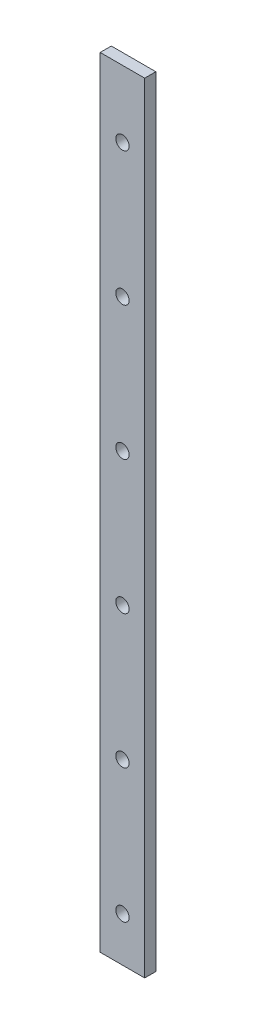
ISO-10303-21;
HEADER;
FILE_DESCRIPTION(('STEP AP214'),'2;1');
FILE_NAME('part.step','',(''),(''),'','','');
FILE_SCHEMA(('AUTOMOTIVE_DESIGN { 1 0 10303 214 1 1 1 1 }'));
ENDSEC;
DATA;
#1=APPLICATION_CONTEXT('core data for automotive mechanical design processes');
#2=APPLICATION_PROTOCOL_DEFINITION('international standard','automotive_design',2000,#1);
#3=PRODUCT_CONTEXT('',#1,'mechanical');
#4=PRODUCT('Part','Part','',(#3));
#5=PRODUCT_RELATED_PRODUCT_CATEGORY('part','',(#4));
#6=PRODUCT_DEFINITION_FORMATION('','',#4);
#7=PRODUCT_DEFINITION_CONTEXT('part definition',#1,'design');
#8=PRODUCT_DEFINITION('design','',#6,#7);
#9=PRODUCT_DEFINITION_SHAPE('','',#8);
#10=(LENGTH_UNIT() NAMED_UNIT(*) SI_UNIT(.MILLI.,.METRE.));
#11=(NAMED_UNIT(*) PLANE_ANGLE_UNIT() SI_UNIT($,.RADIAN.));
#12=(NAMED_UNIT(*) SI_UNIT($,.STERADIAN.) SOLID_ANGLE_UNIT());
#13=UNCERTAINTY_MEASURE_WITH_UNIT(LENGTH_MEASURE(1.E-05),#10,'distance_accuracy_value','');
#14=(GEOMETRIC_REPRESENTATION_CONTEXT(3) GLOBAL_UNCERTAINTY_ASSIGNED_CONTEXT((#13)) GLOBAL_UNIT_ASSIGNED_CONTEXT((#10,
#11,#12)) REPRESENTATION_CONTEXT('',''));
#15=CARTESIAN_POINT('',(0.,0.,0.));
#16=DIRECTION('',(0.,0.,1.));
#17=DIRECTION('',(1.,0.,0.));
#18=AXIS2_PLACEMENT_3D('',#15,#16,#17);
#19=CARTESIAN_POINT('',(0.,320.,-5.));
#20=DIRECTION('',(0.,0.,1.));
#21=DIRECTION('',(1.,0.,0.));
#22=AXIS2_PLACEMENT_3D('',#19,#20,#21);
#23=CYLINDRICAL_SURFACE('',#22,3.);
#24=CARTESIAN_POINT('',(0.,320.,0.));
#25=DIRECTION('',(0.,0.,-1.));
#26=DIRECTION('',(-1.,0.,0.));
#27=AXIS2_PLACEMENT_3D('',#24,#25,#26);
#28=CIRCLE('',#27,3.);
#29=CARTESIAN_POINT('',(-3.,320.,0.));
#30=VERTEX_POINT('',#29);
#31=EDGE_CURVE('E41',#30,#30,#28,.T.);
#32=ORIENTED_EDGE('',*,*,#31,.T.);
#33=EDGE_LOOP('',(#32));
#34=FACE_BOUND('',#33,.T.);
#35=CARTESIAN_POINT('',(0.,320.,5.));
#36=DIRECTION('',(0.,0.,1.));
#37=DIRECTION('',(1.,0.,0.));
#38=AXIS2_PLACEMENT_3D('',#35,#36,#37);
#39=CIRCLE('',#38,3.);
#40=CARTESIAN_POINT('',(3.,320.,5.));
#41=VERTEX_POINT('',#40);
#42=EDGE_CURVE('E11',#41,#41,#39,.T.);
#43=ORIENTED_EDGE('',*,*,#42,.T.);
#44=EDGE_LOOP('',(#43));
#45=FACE_BOUND('',#44,.T.);
#46=ADVANCED_FACE('F33',(#34,#45),#23,.F.);
#47=CARTESIAN_POINT('',(0.,260.,-5.));
#48=DIRECTION('',(0.,0.,1.));
#49=DIRECTION('',(1.,0.,0.));
#50=AXIS2_PLACEMENT_3D('',#47,#48,#49);
#51=CYLINDRICAL_SURFACE('',#50,3.);
#52=CARTESIAN_POINT('',(0.,260.,0.));
#53=DIRECTION('',(0.,0.,-1.));
#54=DIRECTION('',(-1.,0.,0.));
#55=AXIS2_PLACEMENT_3D('',#52,#53,#54);
#56=CIRCLE('',#55,3.);
#57=CARTESIAN_POINT('',(-3.,260.,0.));
#58=VERTEX_POINT('',#57);
#59=EDGE_CURVE('E126',#58,#58,#56,.T.);
#60=ORIENTED_EDGE('',*,*,#59,.T.);
#61=EDGE_LOOP('',(#60));
#62=FACE_BOUND('',#61,.T.);
#63=CARTESIAN_POINT('',(0.,260.,5.));
#64=DIRECTION('',(0.,0.,1.));
#65=DIRECTION('',(1.,0.,0.));
#66=AXIS2_PLACEMENT_3D('',#63,#64,#65);
#67=CIRCLE('',#66,3.);
#68=CARTESIAN_POINT('',(3.,260.,5.));
#69=VERTEX_POINT('',#68);
#70=EDGE_CURVE('E129',#69,#69,#67,.T.);
#71=ORIENTED_EDGE('',*,*,#70,.T.);
#72=EDGE_LOOP('',(#71));
#73=FACE_BOUND('',#72,.T.);
#74=ADVANCED_FACE('F155',(#62,#73),#51,.F.);
#75=CARTESIAN_POINT('',(0.,200.,-5.));
#76=DIRECTION('',(0.,0.,1.));
#77=DIRECTION('',(1.,0.,0.));
#78=AXIS2_PLACEMENT_3D('',#75,#76,#77);
#79=CYLINDRICAL_SURFACE('',#78,3.);
#80=CARTESIAN_POINT('',(0.,200.,0.));
#81=DIRECTION('',(0.,0.,-1.));
#82=DIRECTION('',(-1.,0.,0.));
#83=AXIS2_PLACEMENT_3D('',#80,#81,#82);
#84=CIRCLE('',#83,3.);
#85=CARTESIAN_POINT('',(-3.,200.,0.));
#86=VERTEX_POINT('',#85);
#87=EDGE_CURVE('E120',#86,#86,#84,.T.);
#88=ORIENTED_EDGE('',*,*,#87,.T.);
#89=EDGE_LOOP('',(#88));
#90=FACE_BOUND('',#89,.T.);
#91=CARTESIAN_POINT('',(0.,200.,5.));
#92=DIRECTION('',(0.,0.,1.));
#93=DIRECTION('',(1.,0.,0.));
#94=AXIS2_PLACEMENT_3D('',#91,#92,#93);
#95=CIRCLE('',#94,3.);
#96=CARTESIAN_POINT('',(3.,200.,5.));
#97=VERTEX_POINT('',#96);
#98=EDGE_CURVE('E123',#97,#97,#95,.T.);
#99=ORIENTED_EDGE('',*,*,#98,.T.);
#100=EDGE_LOOP('',(#99));
#101=FACE_BOUND('',#100,.T.);
#102=ADVANCED_FACE('F159',(#90,#101),#79,.F.);
#103=CARTESIAN_POINT('',(0.,140.,-5.));
#104=DIRECTION('',(0.,0.,1.));
#105=DIRECTION('',(1.,0.,0.));
#106=AXIS2_PLACEMENT_3D('',#103,#104,#105);
#107=CYLINDRICAL_SURFACE('',#106,3.);
#108=CARTESIAN_POINT('',(0.,140.,0.));
#109=DIRECTION('',(0.,0.,-1.));
#110=DIRECTION('',(-1.,0.,0.));
#111=AXIS2_PLACEMENT_3D('',#108,#109,#110);
#112=CIRCLE('',#111,3.);
#113=CARTESIAN_POINT('',(-3.,140.,0.));
#114=VERTEX_POINT('',#113);
#115=EDGE_CURVE('E111',#114,#114,#112,.T.);
#116=ORIENTED_EDGE('',*,*,#115,.T.);
#117=EDGE_LOOP('',(#116));
#118=FACE_BOUND('',#117,.T.);
#119=CARTESIAN_POINT('',(0.,140.,5.));
#120=DIRECTION('',(0.,0.,1.));
#121=DIRECTION('',(1.,0.,0.));
#122=AXIS2_PLACEMENT_3D('',#119,#120,#121);
#123=CIRCLE('',#122,3.);
#124=CARTESIAN_POINT('',(3.,140.,5.));
#125=VERTEX_POINT('',#124);
#126=EDGE_CURVE('E117',#125,#125,#123,.T.);
#127=ORIENTED_EDGE('',*,*,#126,.T.);
#128=EDGE_LOOP('',(#127));
#129=FACE_BOUND('',#128,.T.);
#130=ADVANCED_FACE('F164',(#118,#129),#107,.F.);
#131=CARTESIAN_POINT('',(-10.,0.,5.));
#132=DIRECTION('',(1.,0.,0.));
#133=DIRECTION('',(0.,0.,-1.));
#134=AXIS2_PLACEMENT_3D('',#131,#132,#133);
#135=PLANE('',#134);
#136=DIRECTION('',(0.,-1.,0.));
#137=VECTOR('',#136,1.);
#138=CARTESIAN_POINT('',(-10.,0.,0.));
#139=LINE('',#138,#137);
#140=CARTESIAN_POINT('',(-10.,350.,0.));
#141=VERTEX_POINT('',#140);
#142=CARTESIAN_POINT('',(-10.,0.,0.));
#143=VERTEX_POINT('',#142);
#144=EDGE_CURVE('E101',#141,#143,#139,.T.);
#145=ORIENTED_EDGE('',*,*,#144,.T.);
#146=DIRECTION('',(0.,0.,-1.));
#147=VECTOR('',#146,1.);
#148=CARTESIAN_POINT('',(-10.,0.,5.));
#149=LINE('',#148,#147);
#150=CARTESIAN_POINT('',(-10.,0.,5.));
#151=VERTEX_POINT('',#150);
#152=EDGE_CURVE('E92',#151,#143,#149,.T.);
#153=ORIENTED_EDGE('',*,*,#152,.F.);
#154=DIRECTION('',(0.,-1.,0.));
#155=VECTOR('',#154,1.);
#156=CARTESIAN_POINT('',(-10.,0.,5.));
#157=LINE('',#156,#155);
#158=CARTESIAN_POINT('',(-10.,350.,5.));
#159=VERTEX_POINT('',#158);
#160=EDGE_CURVE('E86',#159,#151,#157,.T.);
#161=ORIENTED_EDGE('',*,*,#160,.F.);
#162=DIRECTION('',(0.,0.,-1.));
#163=VECTOR('',#162,1.);
#164=CARTESIAN_POINT('',(-10.,350.,5.));
#165=LINE('',#164,#163);
#166=EDGE_CURVE('E97',#159,#141,#165,.T.);
#167=ORIENTED_EDGE('',*,*,#166,.T.);
#168=EDGE_LOOP('',(#145,#153,#161,#167));
#169=FACE_BOUND('',#168,.T.);
#170=ADVANCED_FACE('F171',(#169),#135,.F.);
#171=CARTESIAN_POINT('',(-10.,0.,5.));
#172=DIRECTION('',(0.,1.,0.));
#173=DIRECTION('',(0.,0.,1.));
#174=AXIS2_PLACEMENT_3D('',#171,#172,#173);
#175=PLANE('',#174);
#176=DIRECTION('',(1.,0.,0.));
#177=VECTOR('',#176,1.);
#178=CARTESIAN_POINT('',(-10.,0.,0.));
#179=LINE('',#178,#177);
#180=CARTESIAN_POINT('',(10.,0.,0.));
#181=VERTEX_POINT('',#180);
#182=EDGE_CURVE('E91',#143,#181,#179,.T.);
#183=ORIENTED_EDGE('',*,*,#182,.T.);
#184=DIRECTION('',(0.,0.,-1.));
#185=VECTOR('',#184,1.);
#186=CARTESIAN_POINT('',(10.,0.,5.));
#187=LINE('',#186,#185);
#188=CARTESIAN_POINT('',(10.,0.,5.));
#189=VERTEX_POINT('',#188);
#190=EDGE_CURVE('E89',#189,#181,#187,.T.);
#191=ORIENTED_EDGE('',*,*,#190,.F.);
#192=DIRECTION('',(1.,0.,0.));
#193=VECTOR('',#192,1.);
#194=CARTESIAN_POINT('',(-10.,0.,5.));
#195=LINE('',#194,#193);
#196=EDGE_CURVE('E80',#151,#189,#195,.T.);
#197=ORIENTED_EDGE('',*,*,#196,.F.);
#198=ORIENTED_EDGE('',*,*,#152,.T.);
#199=EDGE_LOOP('',(#183,#191,#197,#198));
#200=FACE_BOUND('',#199,.T.);
#201=ADVANCED_FACE('F90',(#200),#175,.F.);
#202=CARTESIAN_POINT('',(10.,0.,5.));
#203=DIRECTION('',(-1.,0.,0.));
#204=DIRECTION('',(0.,0.,1.));
#205=AXIS2_PLACEMENT_3D('',#202,#203,#204);
#206=PLANE('',#205);
#207=DIRECTION('',(0.,1.,0.));
#208=VECTOR('',#207,1.);
#209=CARTESIAN_POINT('',(10.,0.,0.));
#210=LINE('',#209,#208);
#211=CARTESIAN_POINT('',(10.,350.,0.));
#212=VERTEX_POINT('',#211);
#213=EDGE_CURVE('E66',#181,#212,#210,.T.);
#214=ORIENTED_EDGE('',*,*,#213,.T.);
#215=DIRECTION('',(0.,0.,-1.));
#216=VECTOR('',#215,1.);
#217=CARTESIAN_POINT('',(10.,350.,5.));
#218=LINE('',#217,#216);
#219=CARTESIAN_POINT('',(10.,350.,5.));
#220=VERTEX_POINT('',#219);
#221=EDGE_CURVE('E93',#220,#212,#218,.T.);
#222=ORIENTED_EDGE('',*,*,#221,.F.);
#223=DIRECTION('',(0.,1.,0.));
#224=VECTOR('',#223,1.);
#225=CARTESIAN_POINT('',(10.,0.,5.));
#226=LINE('',#225,#224);
#227=EDGE_CURVE('E84',#189,#220,#226,.T.);
#228=ORIENTED_EDGE('',*,*,#227,.F.);
#229=ORIENTED_EDGE('',*,*,#190,.T.);
#230=EDGE_LOOP('',(#214,#222,#228,#229));
#231=FACE_BOUND('',#230,.T.);
#232=ADVANCED_FACE('F95',(#231),#206,.F.);
#233=CARTESIAN_POINT('',(-10.,350.,5.));
#234=DIRECTION('',(0.,-1.,0.));
#235=DIRECTION('',(0.,0.,-1.));
#236=AXIS2_PLACEMENT_3D('',#233,#234,#235);
#237=PLANE('',#236);
#238=DIRECTION('',(-1.,0.,0.));
#239=VECTOR('',#238,1.);
#240=CARTESIAN_POINT('',(-10.,350.,0.));
#241=LINE('',#240,#239);
#242=EDGE_CURVE('E72',#212,#141,#241,.T.);
#243=ORIENTED_EDGE('',*,*,#242,.T.);
#244=ORIENTED_EDGE('',*,*,#166,.F.);
#245=DIRECTION('',(-1.,0.,0.));
#246=VECTOR('',#245,1.);
#247=CARTESIAN_POINT('',(-10.,350.,5.));
#248=LINE('',#247,#246);
#249=EDGE_CURVE('E49',#220,#159,#248,.T.);
#250=ORIENTED_EDGE('',*,*,#249,.F.);
#251=ORIENTED_EDGE('',*,*,#221,.T.);
#252=EDGE_LOOP('',(#243,#244,#250,#251));
#253=FACE_BOUND('',#252,.T.);
#254=ADVANCED_FACE('F148',(#253),#237,.F.);
#255=CARTESIAN_POINT('',(0.,0.,5.));
#256=DIRECTION('',(0.,0.,-1.));
#257=DIRECTION('',(-1.,0.,0.));
#258=AXIS2_PLACEMENT_3D('',#255,#256,#257);
#259=PLANE('',#258);
#260=CARTESIAN_POINT('',(0.,80.,5.));
#261=DIRECTION('',(0.,0.,1.));
#262=DIRECTION('',(1.,0.,0.));
#263=AXIS2_PLACEMENT_3D('',#260,#261,#262);
#264=CIRCLE('',#263,3.);
#265=CARTESIAN_POINT('',(3.,80.,5.));
#266=VERTEX_POINT('',#265);
#267=EDGE_CURVE('E254',#266,#266,#264,.T.);
#268=ORIENTED_EDGE('',*,*,#267,.F.);
#269=EDGE_LOOP('',(#268));
#270=FACE_BOUND('',#269,.T.);
#271=CARTESIAN_POINT('',(0.,20.,5.));
#272=DIRECTION('',(0.,0.,1.));
#273=DIRECTION('',(1.,0.,0.));
#274=AXIS2_PLACEMENT_3D('',#271,#272,#273);
#275=CIRCLE('',#274,3.);
#276=CARTESIAN_POINT('',(3.,20.,5.));
#277=VERTEX_POINT('',#276);
#278=EDGE_CURVE('E114',#277,#277,#275,.T.);
#279=ORIENTED_EDGE('',*,*,#278,.F.);
#280=EDGE_LOOP('',(#279));
#281=FACE_BOUND('',#280,.T.);
#282=ORIENTED_EDGE('',*,*,#160,.T.);
#283=ORIENTED_EDGE('',*,*,#196,.T.);
#284=ORIENTED_EDGE('',*,*,#227,.T.);
#285=ORIENTED_EDGE('',*,*,#249,.T.);
#286=EDGE_LOOP('',(#282,#283,#284,#285));
#287=FACE_BOUND('',#286,.T.);
#288=ORIENTED_EDGE('',*,*,#126,.F.);
#289=EDGE_LOOP('',(#288));
#290=FACE_BOUND('',#289,.T.);
#291=ORIENTED_EDGE('',*,*,#98,.F.);
#292=EDGE_LOOP('',(#291));
#293=FACE_BOUND('',#292,.T.);
#294=ORIENTED_EDGE('',*,*,#70,.F.);
#295=EDGE_LOOP('',(#294));
#296=FACE_BOUND('',#295,.T.);
#297=ORIENTED_EDGE('',*,*,#42,.F.);
#298=EDGE_LOOP('',(#297));
#299=FACE_BOUND('',#298,.T.);
#300=ADVANCED_FACE('F81',(#270,#281,#287,#290,#293,#296,#299),#259,.F.);
#301=CARTESIAN_POINT('',(0.,0.,0.));
#302=DIRECTION('',(0.,0.,-1.));
#303=DIRECTION('',(-1.,0.,0.));
#304=AXIS2_PLACEMENT_3D('',#301,#302,#303);
#305=PLANE('',#304);
#306=CARTESIAN_POINT('',(0.,80.,0.));
#307=DIRECTION('',(0.,0.,-1.));
#308=DIRECTION('',(-1.,0.,0.));
#309=AXIS2_PLACEMENT_3D('',#306,#307,#308);
#310=CIRCLE('',#309,3.);
#311=CARTESIAN_POINT('',(-3.,80.,0.));
#312=VERTEX_POINT('',#311);
#313=EDGE_CURVE('E251',#312,#312,#310,.T.);
#314=ORIENTED_EDGE('',*,*,#313,.F.);
#315=EDGE_LOOP('',(#314));
#316=FACE_BOUND('',#315,.T.);
#317=CARTESIAN_POINT('',(0.,20.,0.));
#318=DIRECTION('',(0.,0.,-1.));
#319=DIRECTION('',(-1.,0.,0.));
#320=AXIS2_PLACEMENT_3D('',#317,#318,#319);
#321=CIRCLE('',#320,3.);
#322=CARTESIAN_POINT('',(-3.,20.,0.));
#323=VERTEX_POINT('',#322);
#324=EDGE_CURVE('E104',#323,#323,#321,.T.);
#325=ORIENTED_EDGE('',*,*,#324,.F.);
#326=EDGE_LOOP('',(#325));
#327=FACE_BOUND('',#326,.T.);
#328=ORIENTED_EDGE('',*,*,#144,.F.);
#329=ORIENTED_EDGE('',*,*,#242,.F.);
#330=ORIENTED_EDGE('',*,*,#213,.F.);
#331=ORIENTED_EDGE('',*,*,#182,.F.);
#332=EDGE_LOOP('',(#328,#329,#330,#331));
#333=FACE_BOUND('',#332,.T.);
#334=ORIENTED_EDGE('',*,*,#115,.F.);
#335=EDGE_LOOP('',(#334));
#336=FACE_BOUND('',#335,.T.);
#337=ORIENTED_EDGE('',*,*,#87,.F.);
#338=EDGE_LOOP('',(#337));
#339=FACE_BOUND('',#338,.T.);
#340=ORIENTED_EDGE('',*,*,#59,.F.);
#341=EDGE_LOOP('',(#340));
#342=FACE_BOUND('',#341,.T.);
#343=ORIENTED_EDGE('',*,*,#31,.F.);
#344=EDGE_LOOP('',(#343));
#345=FACE_BOUND('',#344,.T.);
#346=ADVANCED_FACE('F136',(#316,#327,#333,#336,#339,#342,#345),#305,.T.);
#347=CARTESIAN_POINT('',(0.,20.,-5.));
#348=DIRECTION('',(0.,0.,1.));
#349=DIRECTION('',(1.,0.,0.));
#350=AXIS2_PLACEMENT_3D('',#347,#348,#349);
#351=CYLINDRICAL_SURFACE('',#350,3.);
#352=ORIENTED_EDGE('',*,*,#324,.T.);
#353=EDGE_LOOP('',(#352));
#354=FACE_BOUND('',#353,.T.);
#355=ORIENTED_EDGE('',*,*,#278,.T.);
#356=EDGE_LOOP('',(#355));
#357=FACE_BOUND('',#356,.T.);
#358=ADVANCED_FACE('F138',(#354,#357),#351,.F.);
#359=CARTESIAN_POINT('',(0.,80.,-5.));
#360=DIRECTION('',(0.,0.,1.));
#361=DIRECTION('',(1.,0.,0.));
#362=AXIS2_PLACEMENT_3D('',#359,#360,#361);
#363=CYLINDRICAL_SURFACE('',#362,3.);
#364=ORIENTED_EDGE('',*,*,#313,.T.);
#365=EDGE_LOOP('',(#364));
#366=FACE_BOUND('',#365,.T.);
#367=ORIENTED_EDGE('',*,*,#267,.T.);
#368=EDGE_LOOP('',(#367));
#369=FACE_BOUND('',#368,.T.);
#370=ADVANCED_FACE('F145',(#366,#369),#363,.F.);
#371=CLOSED_SHELL('',(#46,#74,#102,#130,#170,#201,#232,#254,#300,#346,#358,#370));
#372=MANIFOLD_SOLID_BREP('B2',#371);
#373=ADVANCED_BREP_SHAPE_REPRESENTATION('',(#18,#372),#14);
#374=SHAPE_DEFINITION_REPRESENTATION(#9,#373);
ENDSEC;
END-ISO-10303-21;
